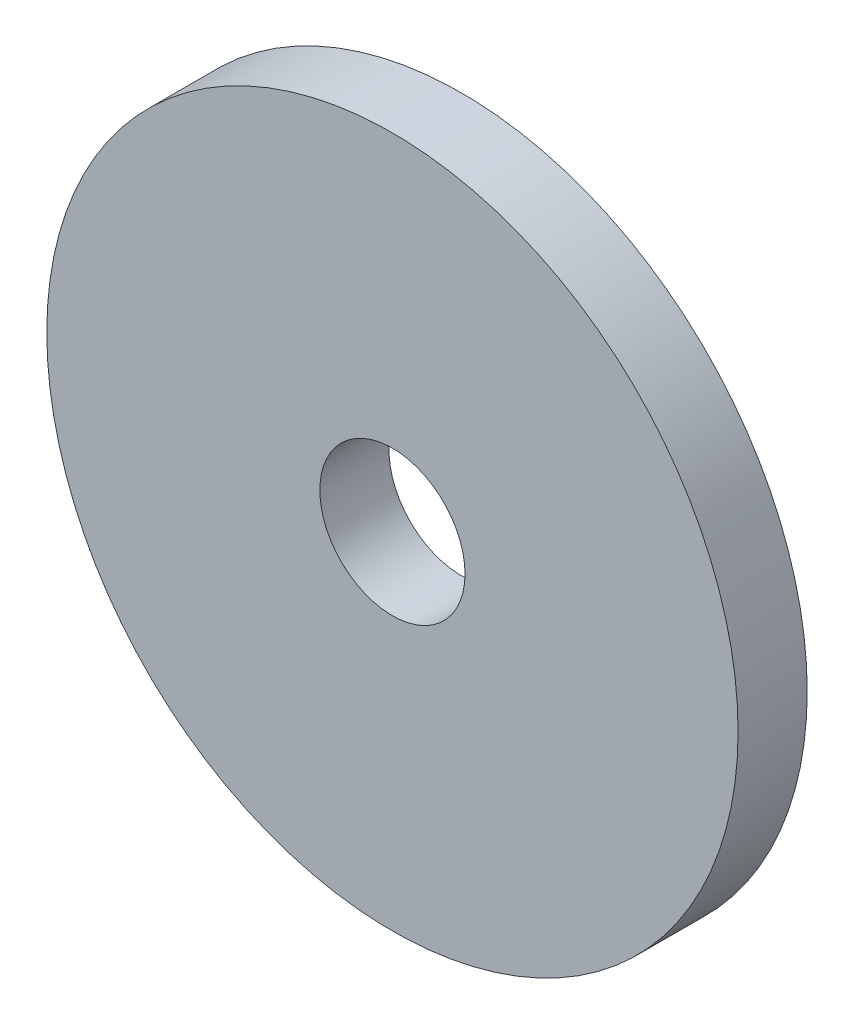
ISO-10303-21;
HEADER;
FILE_DESCRIPTION(('STEP AP214'),'2;1');
FILE_NAME('part.step','',(''),(''),'','','');
FILE_SCHEMA(('AUTOMOTIVE_DESIGN { 1 0 10303 214 1 1 1 1 }'));
ENDSEC;
DATA;
#1=APPLICATION_CONTEXT('core data for automotive mechanical design processes');
#2=APPLICATION_PROTOCOL_DEFINITION('international standard','automotive_design',2000,#1);
#3=PRODUCT_CONTEXT('',#1,'mechanical');
#4=PRODUCT('Part','Part','',(#3));
#5=PRODUCT_RELATED_PRODUCT_CATEGORY('part','',(#4));
#6=PRODUCT_DEFINITION_FORMATION('','',#4);
#7=PRODUCT_DEFINITION_CONTEXT('part definition',#1,'design');
#8=PRODUCT_DEFINITION('design','',#6,#7);
#9=PRODUCT_DEFINITION_SHAPE('','',#8);
#10=(LENGTH_UNIT() NAMED_UNIT(*) SI_UNIT(.MILLI.,.METRE.));
#11=(NAMED_UNIT(*) PLANE_ANGLE_UNIT() SI_UNIT($,.RADIAN.));
#12=(NAMED_UNIT(*) SI_UNIT($,.STERADIAN.) SOLID_ANGLE_UNIT());
#13=UNCERTAINTY_MEASURE_WITH_UNIT(LENGTH_MEASURE(1.E-05),#10,'distance_accuracy_value','');
#14=(GEOMETRIC_REPRESENTATION_CONTEXT(3) GLOBAL_UNCERTAINTY_ASSIGNED_CONTEXT((#13)) GLOBAL_UNIT_ASSIGNED_CONTEXT((#10,
#11,#12)) REPRESENTATION_CONTEXT('',''));
#15=CARTESIAN_POINT('',(0.,0.,0.));
#16=DIRECTION('',(0.,0.,1.));
#17=DIRECTION('',(1.,0.,0.));
#18=AXIS2_PLACEMENT_3D('',#15,#16,#17);
#19=CARTESIAN_POINT('',(0.,0.,5.));
#20=DIRECTION('',(0.,0.,1.));
#21=DIRECTION('',(1.,0.,0.));
#22=AXIS2_PLACEMENT_3D('',#19,#20,#21);
#23=PLANE('',#22);
#24=CARTESIAN_POINT('',(0.,0.,5.));
#25=DIRECTION('',(0.,0.,1.));
#26=DIRECTION('',(1.,0.,0.));
#27=AXIS2_PLACEMENT_3D('',#24,#25,#26);
#28=CIRCLE('',#27,25.);
#29=CARTESIAN_POINT('',(25.,0.,5.));
#30=VERTEX_POINT('',#29);
#31=EDGE_CURVE('E10',#30,#30,#28,.T.);
#32=ORIENTED_EDGE('',*,*,#31,.T.);
#33=EDGE_LOOP('',(#32));
#34=FACE_BOUND('',#33,.T.);
#35=CARTESIAN_POINT('',(0.,0.,5.));
#36=DIRECTION('',(0.,0.,1.));
#37=DIRECTION('',(1.,0.,0.));
#38=AXIS2_PLACEMENT_3D('',#35,#36,#37);
#39=CIRCLE('',#38,5.25);
#40=CARTESIAN_POINT('',(5.25,0.,5.));
#41=VERTEX_POINT('',#40);
#42=EDGE_CURVE('E43',#41,#41,#39,.T.);
#43=ORIENTED_EDGE('',*,*,#42,.F.);
#44=EDGE_LOOP('',(#43));
#45=FACE_BOUND('',#44,.T.);
#46=ADVANCED_FACE('F32',(#34,#45),#23,.T.);
#47=CARTESIAN_POINT('',(0.,0.,0.));
#48=DIRECTION('',(0.,0.,1.));
#49=DIRECTION('',(1.,0.,0.));
#50=AXIS2_PLACEMENT_3D('',#47,#48,#49);
#51=PLANE('',#50);
#52=CARTESIAN_POINT('',(0.,0.,0.));
#53=DIRECTION('',(0.,0.,1.));
#54=DIRECTION('',(1.,0.,0.));
#55=AXIS2_PLACEMENT_3D('',#52,#53,#54);
#56=CIRCLE('',#55,25.);
#57=CARTESIAN_POINT('',(25.,0.,0.));
#58=VERTEX_POINT('',#57);
#59=EDGE_CURVE('E36',#58,#58,#56,.T.);
#60=ORIENTED_EDGE('',*,*,#59,.F.);
#61=EDGE_LOOP('',(#60));
#62=FACE_BOUND('',#61,.T.);
#63=CARTESIAN_POINT('',(0.,0.,0.));
#64=DIRECTION('',(0.,0.,1.));
#65=DIRECTION('',(1.,0.,0.));
#66=AXIS2_PLACEMENT_3D('',#63,#64,#65);
#67=CIRCLE('',#66,5.25);
#68=CARTESIAN_POINT('',(5.25,0.,0.));
#69=VERTEX_POINT('',#68);
#70=EDGE_CURVE('E45',#69,#69,#67,.T.);
#71=ORIENTED_EDGE('',*,*,#70,.T.);
#72=EDGE_LOOP('',(#71));
#73=FACE_BOUND('',#72,.T.);
#74=ADVANCED_FACE('F55',(#62,#73),#51,.F.);
#75=CARTESIAN_POINT('',(0.,0.,5.));
#76=DIRECTION('',(0.,0.,-1.));
#77=DIRECTION('',(-1.,0.,0.));
#78=AXIS2_PLACEMENT_3D('',#75,#76,#77);
#79=CYLINDRICAL_SURFACE('',#78,25.);
#80=ORIENTED_EDGE('',*,*,#31,.F.);
#81=EDGE_LOOP('',(#80));
#82=FACE_BOUND('',#81,.T.);
#83=ORIENTED_EDGE('',*,*,#59,.T.);
#84=EDGE_LOOP('',(#83));
#85=FACE_BOUND('',#84,.T.);
#86=ADVANCED_FACE('F34',(#82,#85),#79,.T.);
#87=CARTESIAN_POINT('',(0.,0.,5.));
#88=DIRECTION('',(0.,0.,-1.));
#89=DIRECTION('',(-1.,0.,0.));
#90=AXIS2_PLACEMENT_3D('',#87,#88,#89);
#91=CYLINDRICAL_SURFACE('',#90,5.25);
#92=ORIENTED_EDGE('',*,*,#42,.T.);
#93=EDGE_LOOP('',(#92));
#94=FACE_BOUND('',#93,.T.);
#95=ORIENTED_EDGE('',*,*,#70,.F.);
#96=EDGE_LOOP('',(#95));
#97=FACE_BOUND('',#96,.T.);
#98=ADVANCED_FACE('F51',(#94,#97),#91,.F.);
#99=CLOSED_SHELL('',(#46,#74,#86,#98));
#100=MANIFOLD_SOLID_BREP('B2',#99);
#101=ADVANCED_BREP_SHAPE_REPRESENTATION('',(#18,#100),#14);
#102=SHAPE_DEFINITION_REPRESENTATION(#9,#101);
ENDSEC;
END-ISO-10303-21;
